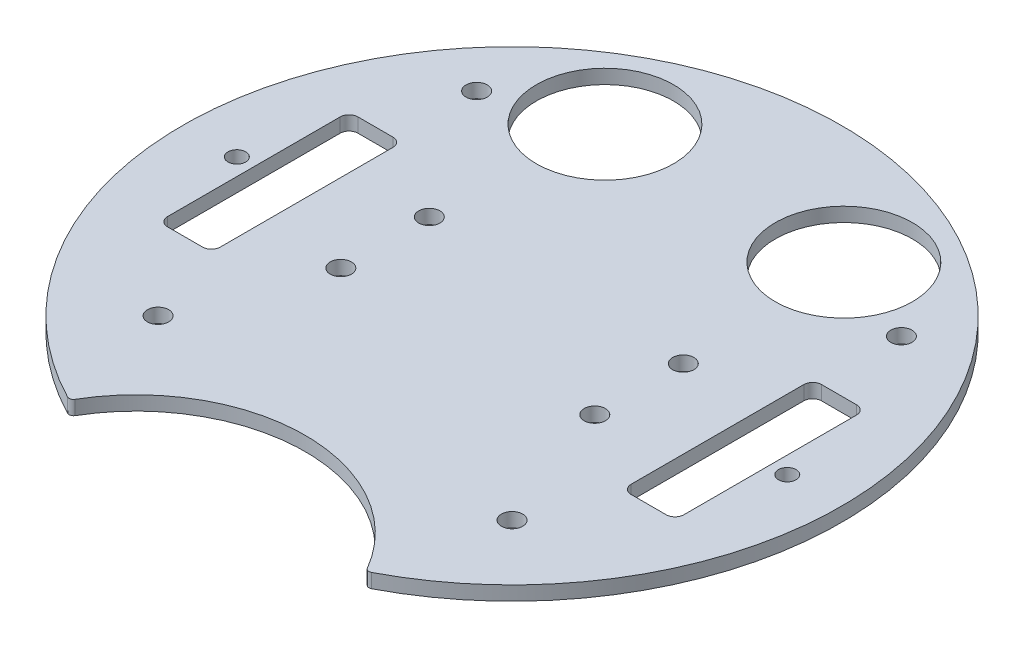
ISO-10303-21;
HEADER;
FILE_DESCRIPTION(('STEP AP214'),'2;1');
FILE_NAME('part.step','',(''),(''),'','','');
FILE_SCHEMA(('AUTOMOTIVE_DESIGN { 1 0 10303 214 1 1 1 1 }'));
ENDSEC;
DATA;
#1=APPLICATION_CONTEXT('core data for automotive mechanical design processes');
#2=APPLICATION_PROTOCOL_DEFINITION('international standard','automotive_design',2000,#1);
#3=PRODUCT_CONTEXT('',#1,'mechanical');
#4=PRODUCT('Part','Part','',(#3));
#5=PRODUCT_RELATED_PRODUCT_CATEGORY('part','',(#4));
#6=PRODUCT_DEFINITION_FORMATION('','',#4);
#7=PRODUCT_DEFINITION_CONTEXT('part definition',#1,'design');
#8=PRODUCT_DEFINITION('design','',#6,#7);
#9=PRODUCT_DEFINITION_SHAPE('','',#8);
#10=(LENGTH_UNIT() NAMED_UNIT(*) SI_UNIT(.MILLI.,.METRE.));
#11=(NAMED_UNIT(*) PLANE_ANGLE_UNIT() SI_UNIT($,.RADIAN.));
#12=(NAMED_UNIT(*) SI_UNIT($,.STERADIAN.) SOLID_ANGLE_UNIT());
#13=UNCERTAINTY_MEASURE_WITH_UNIT(LENGTH_MEASURE(1.E-05),#10,'distance_accuracy_value','');
#14=(GEOMETRIC_REPRESENTATION_CONTEXT(3) GLOBAL_UNCERTAINTY_ASSIGNED_CONTEXT((#13)) GLOBAL_UNIT_ASSIGNED_CONTEXT((#10,
#11,#12)) REPRESENTATION_CONTEXT('',''));
#15=CARTESIAN_POINT('',(0.,0.,0.));
#16=DIRECTION('',(0.,0.,1.));
#17=DIRECTION('',(1.,0.,0.));
#18=AXIS2_PLACEMENT_3D('',#15,#16,#17);
#19=CARTESIAN_POINT('',(33.8990896558132,3.2,65.2158088235294));
#20=DIRECTION('',(0.,-1.,0.));
#21=DIRECTION('',(0.,0.,-1.));
#22=AXIS2_PLACEMENT_3D('',#19,#20,#21);
#23=CYLINDRICAL_SURFACE('',#22,1.);
#24=CARTESIAN_POINT('',(33.8990896558132,0.,65.2158088235294));
#25=DIRECTION('',(0.,1.,0.));
#26=DIRECTION('',(0.,0.,-1.));
#27=AXIS2_PLACEMENT_3D('',#24,#25,#26);
#28=CIRCLE('',#27,1.);
#29=CARTESIAN_POINT('',(33.0354185817797,0.,65.7198646496815));
#30=VERTEX_POINT('',#29);
#31=CARTESIAN_POINT('',(34.3603017599739,0.,66.1030987394958));
#32=VERTEX_POINT('',#31);
#33=EDGE_CURVE('E338',#30,#32,#28,.T.);
#34=ORIENTED_EDGE('',*,*,#33,.T.);
#35=DIRECTION('',(0.,-1.,0.));
#36=VECTOR('',#35,1.);
#37=CARTESIAN_POINT('',(34.3603017599739,3.2,66.1030987394958));
#38=LINE('',#37,#36);
#39=CARTESIAN_POINT('',(34.3603017599739,3.2,66.1030987394958));
#40=VERTEX_POINT('',#39);
#41=EDGE_CURVE('E11',#40,#32,#38,.T.);
#42=ORIENTED_EDGE('',*,*,#41,.F.);
#43=CARTESIAN_POINT('',(33.8990896558132,3.2,65.2158088235294));
#44=DIRECTION('',(0.,1.,0.));
#45=DIRECTION('',(0.,0.,-1.));
#46=AXIS2_PLACEMENT_3D('',#43,#44,#45);
#47=CIRCLE('',#46,1.);
#48=CARTESIAN_POINT('',(33.0354185817797,3.2,65.7198646496815));
#49=VERTEX_POINT('',#48);
#50=EDGE_CURVE('E341',#49,#40,#47,.T.);
#51=ORIENTED_EDGE('',*,*,#50,.F.);
#52=DIRECTION('',(0.,-1.,0.));
#53=VECTOR('',#52,1.);
#54=CARTESIAN_POINT('',(33.0354185817797,3.2,65.7198646496815));
#55=LINE('',#54,#53);
#56=EDGE_CURVE('E351',#49,#30,#55,.T.);
#57=ORIENTED_EDGE('',*,*,#56,.T.);
#58=EDGE_LOOP('',(#34,#42,#51,#57));
#59=FACE_BOUND('',#58,.T.);
#60=ADVANCED_FACE('F33',(#59),#23,.T.);
#61=CARTESIAN_POINT('',(0.,3.2,0.));
#62=DIRECTION('',(0.,-1.,0.));
#63=DIRECTION('',(0.,0.,-1.));
#64=AXIS2_PLACEMENT_3D('',#61,#62,#63);
#65=CYLINDRICAL_SURFACE('',#64,74.5);
#66=CARTESIAN_POINT('',(0.,0.,0.));
#67=DIRECTION('',(0.,1.,0.));
#68=DIRECTION('',(0.,0.,1.));
#69=AXIS2_PLACEMENT_3D('',#66,#67,#68);
#70=CIRCLE('',#69,74.5);
#71=CARTESIAN_POINT('',(-34.360301759974,0.,66.1030987394958));
#72=VERTEX_POINT('',#71);
#73=EDGE_CURVE('E354',#32,#72,#70,.T.);
#74=ORIENTED_EDGE('',*,*,#73,.T.);
#75=DIRECTION('',(0.,-1.,0.));
#76=VECTOR('',#75,1.);
#77=CARTESIAN_POINT('',(-34.360301759974,3.2,66.1030987394958));
#78=LINE('',#77,#76);
#79=CARTESIAN_POINT('',(-34.360301759974,3.2,66.1030987394958));
#80=VERTEX_POINT('',#79);
#81=EDGE_CURVE('E40',#80,#72,#78,.T.);
#82=ORIENTED_EDGE('',*,*,#81,.F.);
#83=CARTESIAN_POINT('',(0.,3.2,0.));
#84=DIRECTION('',(0.,1.,0.));
#85=DIRECTION('',(0.,0.,1.));
#86=AXIS2_PLACEMENT_3D('',#83,#84,#85);
#87=CIRCLE('',#86,74.5);
#88=EDGE_CURVE('E344',#40,#80,#87,.T.);
#89=ORIENTED_EDGE('',*,*,#88,.F.);
#90=ORIENTED_EDGE('',*,*,#41,.T.);
#91=EDGE_LOOP('',(#74,#82,#89,#90));
#92=FACE_BOUND('',#91,.T.);
#93=ADVANCED_FACE('F383',(#92),#65,.T.);
#94=CARTESIAN_POINT('',(-33.8990896558132,3.2,65.2158088235294));
#95=DIRECTION('',(0.,-1.,0.));
#96=DIRECTION('',(0.,0.,-1.));
#97=AXIS2_PLACEMENT_3D('',#94,#95,#96);
#98=CYLINDRICAL_SURFACE('',#97,1.);
#99=CARTESIAN_POINT('',(-33.8990896558132,0.,65.2158088235294));
#100=DIRECTION('',(0.,1.,0.));
#101=DIRECTION('',(0.,0.,-1.));
#102=AXIS2_PLACEMENT_3D('',#99,#100,#101);
#103=CIRCLE('',#102,1.);
#104=CARTESIAN_POINT('',(-33.0354185817797,0.,65.7198646496815));
#105=VERTEX_POINT('',#104);
#106=EDGE_CURVE('E356',#72,#105,#103,.T.);
#107=ORIENTED_EDGE('',*,*,#106,.T.);
#108=DIRECTION('',(0.,-1.,0.));
#109=VECTOR('',#108,1.);
#110=CARTESIAN_POINT('',(-33.0354185817797,3.2,65.7198646496815));
#111=LINE('',#110,#109);
#112=CARTESIAN_POINT('',(-33.0354185817797,3.2,65.7198646496815));
#113=VERTEX_POINT('',#112);
#114=EDGE_CURVE('E361',#113,#105,#111,.T.);
#115=ORIENTED_EDGE('',*,*,#114,.F.);
#116=CARTESIAN_POINT('',(-33.8990896558132,3.2,65.2158088235294));
#117=DIRECTION('',(0.,1.,0.));
#118=DIRECTION('',(0.,0.,-1.));
#119=AXIS2_PLACEMENT_3D('',#116,#117,#118);
#120=CIRCLE('',#119,1.);
#121=EDGE_CURVE('E347',#80,#113,#120,.T.);
#122=ORIENTED_EDGE('',*,*,#121,.F.);
#123=ORIENTED_EDGE('',*,*,#81,.T.);
#124=EDGE_LOOP('',(#107,#115,#122,#123));
#125=FACE_BOUND('',#124,.T.);
#126=ADVANCED_FACE('F368',(#125),#98,.T.);
#127=CARTESIAN_POINT('',(0.,3.2,85.));
#128=DIRECTION('',(0.,-1.,0.));
#129=DIRECTION('',(0.,0.,-1.));
#130=AXIS2_PLACEMENT_3D('',#127,#128,#129);
#131=CYLINDRICAL_SURFACE('',#130,38.25);
#132=CARTESIAN_POINT('',(0.,0.,85.));
#133=DIRECTION('',(0.,-1.,0.));
#134=DIRECTION('',(0.,0.,1.));
#135=AXIS2_PLACEMENT_3D('',#132,#133,#134);
#136=CIRCLE('',#135,38.25);
#137=EDGE_CURVE('E345',#105,#30,#136,.T.);
#138=ORIENTED_EDGE('',*,*,#137,.T.);
#139=ORIENTED_EDGE('',*,*,#56,.F.);
#140=CARTESIAN_POINT('',(0.,3.2,85.));
#141=DIRECTION('',(0.,-1.,0.));
#142=DIRECTION('',(0.,0.,1.));
#143=AXIS2_PLACEMENT_3D('',#140,#141,#142);
#144=CIRCLE('',#143,38.25);
#145=EDGE_CURVE('E349',#113,#49,#144,.T.);
#146=ORIENTED_EDGE('',*,*,#145,.F.);
#147=ORIENTED_EDGE('',*,*,#114,.T.);
#148=EDGE_LOOP('',(#138,#139,#146,#147));
#149=FACE_BOUND('',#148,.T.);
#150=ADVANCED_FACE('F376',(#149),#131,.F.);
#151=CARTESIAN_POINT('',(16.9495448279066,3.2,75.1079044117647));
#152=DIRECTION('',(0.,-1.,0.));
#153=DIRECTION('',(0.,0.,-1.));
#154=AXIS2_PLACEMENT_3D('',#151,#152,#153);
#155=PLANE('',#154);
#156=CARTESIAN_POINT('',(27.,3.2,-48.));
#157=DIRECTION('',(0.,1.,0.));
#158=DIRECTION('',(0.,0.,1.));
#159=AXIS2_PLACEMENT_3D('',#156,#157,#158);
#160=CIRCLE('',#159,15.5);
#161=CARTESIAN_POINT('',(27.,3.2,-32.5));
#162=VERTEX_POINT('',#161);
#163=EDGE_CURVE('E513',#162,#162,#160,.T.);
#164=ORIENTED_EDGE('',*,*,#163,.F.);
#165=EDGE_LOOP('',(#164));
#166=FACE_BOUND('',#165,.T.);
#167=CARTESIAN_POINT('',(-27.,3.2,-48.));
#168=DIRECTION('',(0.,1.,0.));
#169=DIRECTION('',(0.,0.,1.));
#170=AXIS2_PLACEMENT_3D('',#167,#168,#169);
#171=CIRCLE('',#170,15.5);
#172=CARTESIAN_POINT('',(-27.,3.2,-32.5));
#173=VERTEX_POINT('',#172);
#174=EDGE_CURVE('E515',#173,#173,#171,.T.);
#175=ORIENTED_EDGE('',*,*,#174,.F.);
#176=EDGE_LOOP('',(#175));
#177=FACE_BOUND('',#176,.T.);
#178=CARTESIAN_POINT('',(-48.,3.2,-40.));
#179=DIRECTION('',(0.,1.,0.));
#180=DIRECTION('',(0.,0.,-1.));
#181=AXIS2_PLACEMENT_3D('',#178,#179,#180);
#182=CIRCLE('',#181,2.4);
#183=CARTESIAN_POINT('',(-48.,3.2,-42.4));
#184=VERTEX_POINT('',#183);
#185=EDGE_CURVE('E521',#184,#184,#182,.T.);
#186=ORIENTED_EDGE('',*,*,#185,.F.);
#187=EDGE_LOOP('',(#186));
#188=FACE_BOUND('',#187,.T.);
#189=CARTESIAN_POINT('',(40.,3.2,40.));
#190=DIRECTION('',(0.,1.,0.));
#191=DIRECTION('',(0.,0.,-1.));
#192=AXIS2_PLACEMENT_3D('',#189,#190,#191);
#193=CIRCLE('',#192,2.4);
#194=CARTESIAN_POINT('',(40.,3.2,37.6));
#195=VERTEX_POINT('',#194);
#196=EDGE_CURVE('E528',#195,#195,#193,.T.);
#197=ORIENTED_EDGE('',*,*,#196,.F.);
#198=EDGE_LOOP('',(#197));
#199=FACE_BOUND('',#198,.T.);
#200=CARTESIAN_POINT('',(-40.,3.2,40.));
#201=DIRECTION('',(0.,1.,0.));
#202=DIRECTION('',(0.,0.,1.));
#203=AXIS2_PLACEMENT_3D('',#200,#201,#202);
#204=CIRCLE('',#203,2.4);
#205=CARTESIAN_POINT('',(-40.,3.2,42.4));
#206=VERTEX_POINT('',#205);
#207=EDGE_CURVE('E527',#206,#206,#204,.T.);
#208=ORIENTED_EDGE('',*,*,#207,.F.);
#209=EDGE_LOOP('',(#208));
#210=FACE_BOUND('',#209,.T.);
#211=CARTESIAN_POINT('',(48.,3.2,-40.));
#212=DIRECTION('',(0.,1.,0.));
#213=DIRECTION('',(0.,0.,1.));
#214=AXIS2_PLACEMENT_3D('',#211,#212,#213);
#215=CIRCLE('',#214,2.4);
#216=CARTESIAN_POINT('',(48.,3.2,-37.6));
#217=VERTEX_POINT('',#216);
#218=EDGE_CURVE('E539',#217,#217,#215,.T.);
#219=ORIENTED_EDGE('',*,*,#218,.F.);
#220=EDGE_LOOP('',(#219));
#221=FACE_BOUND('',#220,.T.);
#222=CARTESIAN_POINT('',(-28.7007386859688,3.2,10.0000000000002));
#223=DIRECTION('',(0.,-1.,0.));
#224=DIRECTION('',(0.,0.,-1.));
#225=AXIS2_PLACEMENT_3D('',#222,#223,#224);
#226=CIRCLE('',#225,2.4);
#227=CARTESIAN_POINT('',(-28.7007386859688,3.2,7.60000000000018));
#228=VERTEX_POINT('',#227);
#229=EDGE_CURVE('E305',#228,#228,#226,.T.);
#230=ORIENTED_EDGE('',*,*,#229,.T.);
#231=EDGE_LOOP('',(#230));
#232=FACE_BOUND('',#231,.T.);
#233=CARTESIAN_POINT('',(-28.7007386859688,3.2,-9.99999999999983));
#234=DIRECTION('',(0.,-1.,0.));
#235=DIRECTION('',(0.,0.,-1.));
#236=AXIS2_PLACEMENT_3D('',#233,#234,#235);
#237=CIRCLE('',#236,2.4);
#238=CARTESIAN_POINT('',(-28.7007386859688,3.2,-12.3999999999998));
#239=VERTEX_POINT('',#238);
#240=EDGE_CURVE('E312',#239,#239,#237,.T.);
#241=ORIENTED_EDGE('',*,*,#240,.T.);
#242=EDGE_LOOP('',(#241));
#243=FACE_BOUND('',#242,.T.);
#244=CARTESIAN_POINT('',(28.7007386859688,3.2,-9.99999999999982));
#245=DIRECTION('',(0.,-1.,0.));
#246=DIRECTION('',(0.,0.,1.));
#247=AXIS2_PLACEMENT_3D('',#244,#245,#246);
#248=CIRCLE('',#247,2.4);
#249=CARTESIAN_POINT('',(28.7007386859688,3.2,-7.59999999999982));
#250=VERTEX_POINT('',#249);
#251=EDGE_CURVE('E318',#250,#250,#248,.T.);
#252=ORIENTED_EDGE('',*,*,#251,.T.);
#253=EDGE_LOOP('',(#252));
#254=FACE_BOUND('',#253,.T.);
#255=CARTESIAN_POINT('',(28.7007386859688,3.2,10.0000000000002));
#256=DIRECTION('',(0.,-1.,0.));
#257=DIRECTION('',(0.,0.,1.));
#258=AXIS2_PLACEMENT_3D('',#255,#256,#257);
#259=CIRCLE('',#258,2.4);
#260=CARTESIAN_POINT('',(28.7007386859688,3.2,12.4000000000002));
#261=VERTEX_POINT('',#260);
#262=EDGE_CURVE('E324',#261,#261,#259,.T.);
#263=ORIENTED_EDGE('',*,*,#262,.T.);
#264=EDGE_LOOP('',(#263));
#265=FACE_BOUND('',#264,.T.);
#266=CARTESIAN_POINT('',(62.2,3.2,1.78151924979983E-13));
#267=DIRECTION('',(0.,-1.,0.));
#268=DIRECTION('',(0.,0.,1.));
#269=AXIS2_PLACEMENT_3D('',#266,#267,#268);
#270=CIRCLE('',#269,2.);
#271=CARTESIAN_POINT('',(62.2,3.2,2.00000000000017));
#272=VERTEX_POINT('',#271);
#273=EDGE_CURVE('E330',#272,#272,#270,.T.);
#274=ORIENTED_EDGE('',*,*,#273,.T.);
#275=EDGE_LOOP('',(#274));
#276=FACE_BOUND('',#275,.T.);
#277=CARTESIAN_POINT('',(-62.2,3.2,1.6291731879859E-13));
#278=DIRECTION('',(0.,-1.,0.));
#279=DIRECTION('',(0.,0.,-1.));
#280=AXIS2_PLACEMENT_3D('',#277,#278,#279);
#281=CIRCLE('',#280,2.);
#282=CARTESIAN_POINT('',(-62.2,3.2,-1.99999999999984));
#283=VERTEX_POINT('',#282);
#284=EDGE_CURVE('E335',#283,#283,#281,.T.);
#285=ORIENTED_EDGE('',*,*,#284,.T.);
#286=EDGE_LOOP('',(#285));
#287=FACE_BOUND('',#286,.T.);
#288=DIRECTION('',(1.,0.,0.));
#289=VECTOR('',#288,1.);
#290=CARTESIAN_POINT('',(-56.3557864376269,3.2,21.5201365909515));
#291=LINE('',#290,#289);
#292=CARTESIAN_POINT('',(-56.3557864376269,3.2,21.5201365909515));
#293=VERTEX_POINT('',#292);
#294=CARTESIAN_POINT('',(-48.4242135623731,3.2,21.5201365909515));
#295=VERTEX_POINT('',#294);
#296=EDGE_CURVE('E265',#293,#295,#291,.T.);
#297=ORIENTED_EDGE('',*,*,#296,.F.);
#298=CARTESIAN_POINT('',(-56.3557864376269,3.2,19.5201365909515));
#299=DIRECTION('',(0.,1.,0.));
#300=DIRECTION('',(0.,0.,1.));
#301=AXIS2_PLACEMENT_3D('',#298,#299,#300);
#302=CIRCLE('',#301,2.);
#303=CARTESIAN_POINT('',(-58.3557864376269,3.2,19.5201365909515));
#304=VERTEX_POINT('',#303);
#305=EDGE_CURVE('E225',#304,#293,#302,.T.);
#306=ORIENTED_EDGE('',*,*,#305,.F.);
#307=DIRECTION('',(0.,0.,1.));
#308=VECTOR('',#307,1.);
#309=CARTESIAN_POINT('',(-58.3557864376269,3.2,-19.5201365909512));
#310=LINE('',#309,#308);
#311=CARTESIAN_POINT('',(-58.3557864376269,3.2,-19.5201365909512));
#312=VERTEX_POINT('',#311);
#313=EDGE_CURVE('E245',#312,#304,#310,.T.);
#314=ORIENTED_EDGE('',*,*,#313,.F.);
#315=CARTESIAN_POINT('',(-56.3557864376269,3.2,-19.5201365909512));
#316=DIRECTION('',(0.,1.,0.));
#317=DIRECTION('',(0.,0.,1.));
#318=AXIS2_PLACEMENT_3D('',#315,#316,#317);
#319=CIRCLE('',#318,1.99999999999999);
#320=CARTESIAN_POINT('',(-56.3557864376269,3.2,-21.5201365909512));
#321=VERTEX_POINT('',#320);
#322=EDGE_CURVE('E278',#321,#312,#319,.T.);
#323=ORIENTED_EDGE('',*,*,#322,.F.);
#324=DIRECTION('',(-1.,0.,0.));
#325=VECTOR('',#324,1.);
#326=CARTESIAN_POINT('',(-56.3557864376269,3.2,-21.5201365909512));
#327=LINE('',#326,#325);
#328=CARTESIAN_POINT('',(-48.4242135623731,3.2,-21.5201365909512));
#329=VERTEX_POINT('',#328);
#330=EDGE_CURVE('E275',#329,#321,#327,.T.);
#331=ORIENTED_EDGE('',*,*,#330,.F.);
#332=CARTESIAN_POINT('',(-48.4242135623731,3.2,-19.5201365909512));
#333=DIRECTION('',(0.,1.,0.));
#334=DIRECTION('',(0.,0.,-1.));
#335=AXIS2_PLACEMENT_3D('',#332,#333,#334);
#336=CIRCLE('',#335,2.);
#337=CARTESIAN_POINT('',(-46.4242135623731,3.2,-19.5201365909512));
#338=VERTEX_POINT('',#337);
#339=EDGE_CURVE('E273',#338,#329,#336,.T.);
#340=ORIENTED_EDGE('',*,*,#339,.F.);
#341=DIRECTION('',(0.,0.,-1.));
#342=VECTOR('',#341,1.);
#343=CARTESIAN_POINT('',(-46.4242135623731,3.2,-19.5201365909512));
#344=LINE('',#343,#342);
#345=CARTESIAN_POINT('',(-46.4242135623731,3.2,19.5201365909515));
#346=VERTEX_POINT('',#345);
#347=EDGE_CURVE('E270',#346,#338,#344,.T.);
#348=ORIENTED_EDGE('',*,*,#347,.F.);
#349=CARTESIAN_POINT('',(-48.4242135623731,3.2,19.5201365909515));
#350=DIRECTION('',(0.,1.,0.));
#351=DIRECTION('',(0.,0.,1.));
#352=AXIS2_PLACEMENT_3D('',#349,#350,#351);
#353=CIRCLE('',#352,2.);
#354=EDGE_CURVE('E268',#295,#346,#353,.T.);
#355=ORIENTED_EDGE('',*,*,#354,.F.);
#356=EDGE_LOOP('',(#297,#306,#314,#323,#331,#340,#348,#355));
#357=FACE_BOUND('',#356,.T.);
#358=DIRECTION('',(-1.,0.,0.));
#359=VECTOR('',#358,1.);
#360=CARTESIAN_POINT('',(56.3557864376269,3.2,-21.5201365909512));
#361=LINE('',#360,#359);
#362=CARTESIAN_POINT('',(56.3557864376269,3.2,-21.5201365909512));
#363=VERTEX_POINT('',#362);
#364=CARTESIAN_POINT('',(48.4242135623731,3.2,-21.5201365909512));
#365=VERTEX_POINT('',#364);
#366=EDGE_CURVE('E206',#363,#365,#361,.T.);
#367=ORIENTED_EDGE('',*,*,#366,.F.);
#368=CARTESIAN_POINT('',(56.3557864376269,3.2,-19.5201365909512));
#369=DIRECTION('',(0.,1.,0.));
#370=DIRECTION('',(0.,0.,-1.));
#371=AXIS2_PLACEMENT_3D('',#368,#369,#370);
#372=CIRCLE('',#371,1.99999999999999);
#373=CARTESIAN_POINT('',(58.3557864376269,3.2,-19.5201365909512));
#374=VERTEX_POINT('',#373);
#375=EDGE_CURVE('E184',#374,#363,#372,.T.);
#376=ORIENTED_EDGE('',*,*,#375,.F.);
#377=DIRECTION('',(0.,0.,-1.));
#378=VECTOR('',#377,1.);
#379=CARTESIAN_POINT('',(58.3557864376269,3.2,-19.5201365909512));
#380=LINE('',#379,#378);
#381=CARTESIAN_POINT('',(58.3557864376269,3.2,19.5201365909515));
#382=VERTEX_POINT('',#381);
#383=EDGE_CURVE('E181',#382,#374,#380,.T.);
#384=ORIENTED_EDGE('',*,*,#383,.F.);
#385=CARTESIAN_POINT('',(56.3557864376269,3.2,19.5201365909515));
#386=DIRECTION('',(0.,1.,0.));
#387=DIRECTION('',(0.,0.,-1.));
#388=AXIS2_PLACEMENT_3D('',#385,#386,#387);
#389=CIRCLE('',#388,2.);
#390=CARTESIAN_POINT('',(56.3557864376269,3.2,21.5201365909515));
#391=VERTEX_POINT('',#390);
#392=EDGE_CURVE('E219',#391,#382,#389,.T.);
#393=ORIENTED_EDGE('',*,*,#392,.F.);
#394=DIRECTION('',(1.,0.,0.));
#395=VECTOR('',#394,1.);
#396=CARTESIAN_POINT('',(56.3557864376269,3.2,21.5201365909515));
#397=LINE('',#396,#395);
#398=CARTESIAN_POINT('',(48.4242135623731,3.2,21.5201365909515));
#399=VERTEX_POINT('',#398);
#400=EDGE_CURVE('E216',#399,#391,#397,.T.);
#401=ORIENTED_EDGE('',*,*,#400,.F.);
#402=CARTESIAN_POINT('',(48.4242135623731,3.2,19.5201365909515));
#403=DIRECTION('',(0.,1.,0.));
#404=DIRECTION('',(0.,0.,-1.));
#405=AXIS2_PLACEMENT_3D('',#402,#403,#404);
#406=CIRCLE('',#405,2.);
#407=CARTESIAN_POINT('',(46.4242135623731,3.2,19.5201365909515));
#408=VERTEX_POINT('',#407);
#409=EDGE_CURVE('E214',#408,#399,#406,.T.);
#410=ORIENTED_EDGE('',*,*,#409,.F.);
#411=DIRECTION('',(0.,0.,1.));
#412=VECTOR('',#411,1.);
#413=CARTESIAN_POINT('',(46.4242135623731,3.2,-19.5201365909512));
#414=LINE('',#413,#412);
#415=CARTESIAN_POINT('',(46.4242135623731,3.2,-19.5201365909512));
#416=VERTEX_POINT('',#415);
#417=EDGE_CURVE('E211',#416,#408,#414,.T.);
#418=ORIENTED_EDGE('',*,*,#417,.F.);
#419=CARTESIAN_POINT('',(48.4242135623731,3.2,-19.5201365909512));
#420=DIRECTION('',(0.,1.,0.));
#421=DIRECTION('',(0.,0.,1.));
#422=AXIS2_PLACEMENT_3D('',#419,#420,#421);
#423=CIRCLE('',#422,2.);
#424=EDGE_CURVE('E209',#365,#416,#423,.T.);
#425=ORIENTED_EDGE('',*,*,#424,.F.);
#426=EDGE_LOOP('',(#367,#376,#384,#393,#401,#410,#418,#425));
#427=FACE_BOUND('',#426,.T.);
#428=ORIENTED_EDGE('',*,*,#50,.T.);
#429=ORIENTED_EDGE('',*,*,#88,.T.);
#430=ORIENTED_EDGE('',*,*,#121,.T.);
#431=ORIENTED_EDGE('',*,*,#145,.T.);
#432=EDGE_LOOP('',(#428,#429,#430,#431));
#433=FACE_BOUND('',#432,.T.);
#434=ADVANCED_FACE('F382',(#166,#177,#188,#199,#210,#221,#232,#243,#254,#265,#276,#287,#357,
#427,#433),#155,.F.);
#435=CARTESIAN_POINT('',(16.9495448279066,0.,75.1079044117647));
#436=DIRECTION('',(0.,-1.,0.));
#437=DIRECTION('',(0.,0.,-1.));
#438=AXIS2_PLACEMENT_3D('',#435,#436,#437);
#439=PLANE('',#438);
#440=CARTESIAN_POINT('',(27.,0.,-48.));
#441=DIRECTION('',(0.,1.,0.));
#442=DIRECTION('',(0.,0.,1.));
#443=AXIS2_PLACEMENT_3D('',#440,#441,#442);
#444=CIRCLE('',#443,15.5);
#445=CARTESIAN_POINT('',(27.,0.,-32.5));
#446=VERTEX_POINT('',#445);
#447=EDGE_CURVE('E510',#446,#446,#444,.T.);
#448=ORIENTED_EDGE('',*,*,#447,.T.);
#449=EDGE_LOOP('',(#448));
#450=FACE_BOUND('',#449,.T.);
#451=CARTESIAN_POINT('',(-27.,0.,-48.));
#452=DIRECTION('',(0.,1.,0.));
#453=DIRECTION('',(0.,0.,1.));
#454=AXIS2_PLACEMENT_3D('',#451,#452,#453);
#455=CIRCLE('',#454,15.5);
#456=CARTESIAN_POINT('',(-27.,0.,-32.5));
#457=VERTEX_POINT('',#456);
#458=EDGE_CURVE('E518',#457,#457,#455,.T.);
#459=ORIENTED_EDGE('',*,*,#458,.T.);
#460=EDGE_LOOP('',(#459));
#461=FACE_BOUND('',#460,.T.);
#462=CARTESIAN_POINT('',(-48.,0.,-40.));
#463=DIRECTION('',(0.,1.,0.));
#464=DIRECTION('',(0.,0.,-1.));
#465=AXIS2_PLACEMENT_3D('',#462,#463,#464);
#466=CIRCLE('',#465,2.4);
#467=CARTESIAN_POINT('',(-48.,0.,-42.4));
#468=VERTEX_POINT('',#467);
#469=EDGE_CURVE('E531',#468,#468,#466,.T.);
#470=ORIENTED_EDGE('',*,*,#469,.T.);
#471=EDGE_LOOP('',(#470));
#472=FACE_BOUND('',#471,.T.);
#473=CARTESIAN_POINT('',(40.,0.,40.));
#474=DIRECTION('',(0.,1.,0.));
#475=DIRECTION('',(0.,0.,-1.));
#476=AXIS2_PLACEMENT_3D('',#473,#474,#475);
#477=CIRCLE('',#476,2.4);
#478=CARTESIAN_POINT('',(40.,0.,37.6));
#479=VERTEX_POINT('',#478);
#480=EDGE_CURVE('E524',#479,#479,#477,.T.);
#481=ORIENTED_EDGE('',*,*,#480,.T.);
#482=EDGE_LOOP('',(#481));
#483=FACE_BOUND('',#482,.T.);
#484=CARTESIAN_POINT('',(-40.,0.,40.));
#485=DIRECTION('',(0.,1.,0.));
#486=DIRECTION('',(0.,0.,1.));
#487=AXIS2_PLACEMENT_3D('',#484,#485,#486);
#488=CIRCLE('',#487,2.4);
#489=CARTESIAN_POINT('',(-40.,0.,42.4));
#490=VERTEX_POINT('',#489);
#491=EDGE_CURVE('E536',#490,#490,#488,.T.);
#492=ORIENTED_EDGE('',*,*,#491,.T.);
#493=EDGE_LOOP('',(#492));
#494=FACE_BOUND('',#493,.T.);
#495=CARTESIAN_POINT('',(48.,0.,-40.));
#496=DIRECTION('',(0.,1.,0.));
#497=DIRECTION('',(0.,0.,1.));
#498=AXIS2_PLACEMENT_3D('',#495,#496,#497);
#499=CIRCLE('',#498,2.4);
#500=CARTESIAN_POINT('',(48.,0.,-37.6));
#501=VERTEX_POINT('',#500);
#502=EDGE_CURVE('E207',#501,#501,#499,.T.);
#503=ORIENTED_EDGE('',*,*,#502,.T.);
#504=EDGE_LOOP('',(#503));
#505=FACE_BOUND('',#504,.T.);
#506=CARTESIAN_POINT('',(56.3557864376269,0.,-19.5201365909512));
#507=DIRECTION('',(0.,1.,0.));
#508=DIRECTION('',(0.,0.,-1.));
#509=AXIS2_PLACEMENT_3D('',#506,#507,#508);
#510=CIRCLE('',#509,1.99999999999999);
#511=CARTESIAN_POINT('',(58.3557864376269,0.,-19.5201365909512));
#512=VERTEX_POINT('',#511);
#513=CARTESIAN_POINT('',(56.3557864376269,0.,-21.5201365909512));
#514=VERTEX_POINT('',#513);
#515=EDGE_CURVE('E173',#512,#514,#510,.T.);
#516=ORIENTED_EDGE('',*,*,#515,.T.);
#517=DIRECTION('',(-1.,0.,0.));
#518=VECTOR('',#517,1.);
#519=CARTESIAN_POINT('',(56.3557864376269,0.,-21.5201365909512));
#520=LINE('',#519,#518);
#521=CARTESIAN_POINT('',(48.4242135623731,0.,-21.5201365909512));
#522=VERTEX_POINT('',#521);
#523=EDGE_CURVE('E176',#514,#522,#520,.T.);
#524=ORIENTED_EDGE('',*,*,#523,.T.);
#525=CARTESIAN_POINT('',(48.4242135623731,0.,-19.5201365909512));
#526=DIRECTION('',(0.,1.,0.));
#527=DIRECTION('',(0.,0.,1.));
#528=AXIS2_PLACEMENT_3D('',#525,#526,#527);
#529=CIRCLE('',#528,2.);
#530=CARTESIAN_POINT('',(46.4242135623731,0.,-19.5201365909512));
#531=VERTEX_POINT('',#530);
#532=EDGE_CURVE('E55',#522,#531,#529,.T.);
#533=ORIENTED_EDGE('',*,*,#532,.T.);
#534=DIRECTION('',(0.,0.,1.));
#535=VECTOR('',#534,1.);
#536=CARTESIAN_POINT('',(46.4242135623731,0.,-19.5201365909512));
#537=LINE('',#536,#535);
#538=CARTESIAN_POINT('',(46.4242135623731,0.,19.5201365909515));
#539=VERTEX_POINT('',#538);
#540=EDGE_CURVE('E190',#531,#539,#537,.T.);
#541=ORIENTED_EDGE('',*,*,#540,.T.);
#542=CARTESIAN_POINT('',(48.4242135623731,0.,19.5201365909515));
#543=DIRECTION('',(0.,1.,0.));
#544=DIRECTION('',(0.,0.,-1.));
#545=AXIS2_PLACEMENT_3D('',#542,#543,#544);
#546=CIRCLE('',#545,2.);
#547=CARTESIAN_POINT('',(48.4242135623731,0.,21.5201365909515));
#548=VERTEX_POINT('',#547);
#549=EDGE_CURVE('E196',#539,#548,#546,.T.);
#550=ORIENTED_EDGE('',*,*,#549,.T.);
#551=DIRECTION('',(1.,0.,0.));
#552=VECTOR('',#551,1.);
#553=CARTESIAN_POINT('',(56.3557864376269,0.,21.5201365909515));
#554=LINE('',#553,#552);
#555=CARTESIAN_POINT('',(56.3557864376269,0.,21.5201365909515));
#556=VERTEX_POINT('',#555);
#557=EDGE_CURVE('E199',#548,#556,#554,.T.);
#558=ORIENTED_EDGE('',*,*,#557,.T.);
#559=CARTESIAN_POINT('',(56.3557864376269,0.,19.5201365909515));
#560=DIRECTION('',(0.,1.,0.));
#561=DIRECTION('',(0.,0.,-1.));
#562=AXIS2_PLACEMENT_3D('',#559,#560,#561);
#563=CIRCLE('',#562,2.);
#564=CARTESIAN_POINT('',(58.3557864376269,0.,19.5201365909515));
#565=VERTEX_POINT('',#564);
#566=EDGE_CURVE('E202',#556,#565,#563,.T.);
#567=ORIENTED_EDGE('',*,*,#566,.T.);
#568=DIRECTION('',(0.,0.,-1.));
#569=VECTOR('',#568,1.);
#570=CARTESIAN_POINT('',(58.3557864376269,0.,-19.5201365909512));
#571=LINE('',#570,#569);
#572=EDGE_CURVE('E178',#565,#512,#571,.T.);
#573=ORIENTED_EDGE('',*,*,#572,.T.);
#574=EDGE_LOOP('',(#516,#524,#533,#541,#550,#558,#567,#573));
#575=FACE_BOUND('',#574,.T.);
#576=CARTESIAN_POINT('',(-56.3557864376269,0.,19.5201365909515));
#577=DIRECTION('',(0.,1.,0.));
#578=DIRECTION('',(0.,0.,1.));
#579=AXIS2_PLACEMENT_3D('',#576,#577,#578);
#580=CIRCLE('',#579,2.);
#581=CARTESIAN_POINT('',(-58.3557864376269,0.,19.5201365909515));
#582=VERTEX_POINT('',#581);
#583=CARTESIAN_POINT('',(-56.3557864376269,0.,21.5201365909515));
#584=VERTEX_POINT('',#583);
#585=EDGE_CURVE('E241',#582,#584,#580,.T.);
#586=ORIENTED_EDGE('',*,*,#585,.T.);
#587=DIRECTION('',(1.,0.,0.));
#588=VECTOR('',#587,1.);
#589=CARTESIAN_POINT('',(-56.3557864376269,0.,21.5201365909515));
#590=LINE('',#589,#588);
#591=CARTESIAN_POINT('',(-48.4242135623731,0.,21.5201365909515));
#592=VERTEX_POINT('',#591);
#593=EDGE_CURVE('E244',#584,#592,#590,.T.);
#594=ORIENTED_EDGE('',*,*,#593,.T.);
#595=CARTESIAN_POINT('',(-48.4242135623731,0.,19.5201365909515));
#596=DIRECTION('',(0.,1.,0.));
#597=DIRECTION('',(0.,0.,1.));
#598=AXIS2_PLACEMENT_3D('',#595,#596,#597);
#599=CIRCLE('',#598,2.);
#600=CARTESIAN_POINT('',(-46.4242135623731,0.,19.5201365909515));
#601=VERTEX_POINT('',#600);
#602=EDGE_CURVE('E248',#592,#601,#599,.T.);
#603=ORIENTED_EDGE('',*,*,#602,.T.);
#604=DIRECTION('',(0.,0.,-1.));
#605=VECTOR('',#604,1.);
#606=CARTESIAN_POINT('',(-46.4242135623731,0.,-19.5201365909512));
#607=LINE('',#606,#605);
#608=CARTESIAN_POINT('',(-46.4242135623731,0.,-19.5201365909512));
#609=VERTEX_POINT('',#608);
#610=EDGE_CURVE('E250',#601,#609,#607,.T.);
#611=ORIENTED_EDGE('',*,*,#610,.T.);
#612=CARTESIAN_POINT('',(-48.4242135623731,0.,-19.5201365909512));
#613=DIRECTION('',(0.,1.,0.));
#614=DIRECTION('',(0.,0.,-1.));
#615=AXIS2_PLACEMENT_3D('',#612,#613,#614);
#616=CIRCLE('',#615,2.);
#617=CARTESIAN_POINT('',(-48.4242135623731,0.,-21.5201365909512));
#618=VERTEX_POINT('',#617);
#619=EDGE_CURVE('E253',#609,#618,#616,.T.);
#620=ORIENTED_EDGE('',*,*,#619,.T.);
#621=DIRECTION('',(-1.,0.,0.));
#622=VECTOR('',#621,1.);
#623=CARTESIAN_POINT('',(-56.3557864376269,0.,-21.5201365909512));
#624=LINE('',#623,#622);
#625=CARTESIAN_POINT('',(-56.3557864376269,0.,-21.5201365909512));
#626=VERTEX_POINT('',#625);
#627=EDGE_CURVE('E255',#618,#626,#624,.T.);
#628=ORIENTED_EDGE('',*,*,#627,.T.);
#629=CARTESIAN_POINT('',(-56.3557864376269,0.,-19.5201365909512));
#630=DIRECTION('',(0.,1.,0.));
#631=DIRECTION('',(0.,0.,1.));
#632=AXIS2_PLACEMENT_3D('',#629,#630,#631);
#633=CIRCLE('',#632,1.99999999999999);
#634=CARTESIAN_POINT('',(-58.3557864376269,0.,-19.5201365909512));
#635=VERTEX_POINT('',#634);
#636=EDGE_CURVE('E258',#626,#635,#633,.T.);
#637=ORIENTED_EDGE('',*,*,#636,.T.);
#638=DIRECTION('',(0.,0.,1.));
#639=VECTOR('',#638,1.);
#640=CARTESIAN_POINT('',(-58.3557864376269,0.,-19.5201365909512));
#641=LINE('',#640,#639);
#642=EDGE_CURVE('E260',#635,#582,#641,.T.);
#643=ORIENTED_EDGE('',*,*,#642,.T.);
#644=EDGE_LOOP('',(#586,#594,#603,#611,#620,#628,#637,#643));
#645=FACE_BOUND('',#644,.T.);
#646=CARTESIAN_POINT('',(-28.7007386859688,0.,10.0000000000002));
#647=DIRECTION('',(0.,-1.,0.));
#648=DIRECTION('',(0.,0.,-1.));
#649=AXIS2_PLACEMENT_3D('',#646,#647,#648);
#650=CIRCLE('',#649,2.4);
#651=CARTESIAN_POINT('',(-28.7007386859688,0.,7.60000000000018));
#652=VERTEX_POINT('',#651);
#653=EDGE_CURVE('E309',#652,#652,#650,.T.);
#654=ORIENTED_EDGE('',*,*,#653,.F.);
#655=EDGE_LOOP('',(#654));
#656=FACE_BOUND('',#655,.T.);
#657=CARTESIAN_POINT('',(-28.7007386859688,0.,-9.99999999999983));
#658=DIRECTION('',(0.,-1.,0.));
#659=DIRECTION('',(0.,0.,-1.));
#660=AXIS2_PLACEMENT_3D('',#657,#658,#659);
#661=CIRCLE('',#660,2.4);
#662=CARTESIAN_POINT('',(-28.7007386859688,0.,-12.3999999999998));
#663=VERTEX_POINT('',#662);
#664=EDGE_CURVE('E315',#663,#663,#661,.T.);
#665=ORIENTED_EDGE('',*,*,#664,.F.);
#666=EDGE_LOOP('',(#665));
#667=FACE_BOUND('',#666,.T.);
#668=CARTESIAN_POINT('',(28.7007386859688,0.,-9.99999999999982));
#669=DIRECTION('',(0.,-1.,0.));
#670=DIRECTION('',(0.,0.,1.));
#671=AXIS2_PLACEMENT_3D('',#668,#669,#670);
#672=CIRCLE('',#671,2.4);
#673=CARTESIAN_POINT('',(28.7007386859688,0.,-7.59999999999982));
#674=VERTEX_POINT('',#673);
#675=EDGE_CURVE('E321',#674,#674,#672,.T.);
#676=ORIENTED_EDGE('',*,*,#675,.F.);
#677=EDGE_LOOP('',(#676));
#678=FACE_BOUND('',#677,.T.);
#679=CARTESIAN_POINT('',(28.7007386859688,0.,10.0000000000002));
#680=DIRECTION('',(0.,-1.,0.));
#681=DIRECTION('',(0.,0.,1.));
#682=AXIS2_PLACEMENT_3D('',#679,#680,#681);
#683=CIRCLE('',#682,2.4);
#684=CARTESIAN_POINT('',(28.7007386859688,0.,12.4000000000002));
#685=VERTEX_POINT('',#684);
#686=EDGE_CURVE('E327',#685,#685,#683,.T.);
#687=ORIENTED_EDGE('',*,*,#686,.F.);
#688=EDGE_LOOP('',(#687));
#689=FACE_BOUND('',#688,.T.);
#690=CARTESIAN_POINT('',(62.2,0.,1.78151924979983E-13));
#691=DIRECTION('',(0.,-1.,0.));
#692=DIRECTION('',(0.,0.,1.));
#693=AXIS2_PLACEMENT_3D('',#690,#691,#692);
#694=CIRCLE('',#693,2.);
#695=CARTESIAN_POINT('',(62.2,0.,2.00000000000017));
#696=VERTEX_POINT('',#695);
#697=EDGE_CURVE('E284',#696,#696,#694,.T.);
#698=ORIENTED_EDGE('',*,*,#697,.F.);
#699=EDGE_LOOP('',(#698));
#700=FACE_BOUND('',#699,.T.);
#701=CARTESIAN_POINT('',(-62.2,0.,1.6291731879859E-13));
#702=DIRECTION('',(0.,-1.,0.));
#703=DIRECTION('',(0.,0.,-1.));
#704=AXIS2_PLACEMENT_3D('',#701,#702,#703);
#705=CIRCLE('',#704,2.);
#706=CARTESIAN_POINT('',(-62.2,0.,-1.99999999999984));
#707=VERTEX_POINT('',#706);
#708=EDGE_CURVE('E308',#707,#707,#705,.T.);
#709=ORIENTED_EDGE('',*,*,#708,.F.);
#710=EDGE_LOOP('',(#709));
#711=FACE_BOUND('',#710,.T.);
#712=ORIENTED_EDGE('',*,*,#33,.F.);
#713=ORIENTED_EDGE('',*,*,#137,.F.);
#714=ORIENTED_EDGE('',*,*,#106,.F.);
#715=ORIENTED_EDGE('',*,*,#73,.F.);
#716=EDGE_LOOP('',(#712,#713,#714,#715));
#717=FACE_BOUND('',#716,.T.);
#718=ADVANCED_FACE('F174',(#450,#461,#472,#483,#494,#505,#575,#645,#656,#667,#678,#689,#700,
#711,#717),#439,.T.);
#719=CARTESIAN_POINT('',(-62.2,3.2,1.6291731879859E-13));
#720=DIRECTION('',(0.,-1.,0.));
#721=DIRECTION('',(0.,0.,-1.));
#722=AXIS2_PLACEMENT_3D('',#719,#720,#721);
#723=CYLINDRICAL_SURFACE('',#722,2.);
#724=ORIENTED_EDGE('',*,*,#284,.F.);
#725=EDGE_LOOP('',(#724));
#726=FACE_BOUND('',#725,.T.);
#727=ORIENTED_EDGE('',*,*,#708,.T.);
#728=EDGE_LOOP('',(#727));
#729=FACE_BOUND('',#728,.T.);
#730=ADVANCED_FACE('F395',(#726,#729),#723,.F.);
#731=CARTESIAN_POINT('',(62.2,3.2,1.78151924979983E-13));
#732=DIRECTION('',(0.,-1.,0.));
#733=DIRECTION('',(0.,0.,-1.));
#734=AXIS2_PLACEMENT_3D('',#731,#732,#733);
#735=CYLINDRICAL_SURFACE('',#734,2.);
#736=ORIENTED_EDGE('',*,*,#273,.F.);
#737=EDGE_LOOP('',(#736));
#738=FACE_BOUND('',#737,.T.);
#739=ORIENTED_EDGE('',*,*,#697,.T.);
#740=EDGE_LOOP('',(#739));
#741=FACE_BOUND('',#740,.T.);
#742=ADVANCED_FACE('F402',(#738,#741),#735,.F.);
#743=CARTESIAN_POINT('',(28.7007386859688,3.2,10.0000000000002));
#744=DIRECTION('',(0.,-1.,0.));
#745=DIRECTION('',(0.,0.,-1.));
#746=AXIS2_PLACEMENT_3D('',#743,#744,#745);
#747=CYLINDRICAL_SURFACE('',#746,2.4);
#748=ORIENTED_EDGE('',*,*,#262,.F.);
#749=EDGE_LOOP('',(#748));
#750=FACE_BOUND('',#749,.T.);
#751=ORIENTED_EDGE('',*,*,#686,.T.);
#752=EDGE_LOOP('',(#751));
#753=FACE_BOUND('',#752,.T.);
#754=ADVANCED_FACE('F406',(#750,#753),#747,.F.);
#755=CARTESIAN_POINT('',(28.7007386859688,3.2,-9.99999999999982));
#756=DIRECTION('',(0.,-1.,0.));
#757=DIRECTION('',(0.,0.,-1.));
#758=AXIS2_PLACEMENT_3D('',#755,#756,#757);
#759=CYLINDRICAL_SURFACE('',#758,2.4);
#760=ORIENTED_EDGE('',*,*,#251,.F.);
#761=EDGE_LOOP('',(#760));
#762=FACE_BOUND('',#761,.T.);
#763=ORIENTED_EDGE('',*,*,#675,.T.);
#764=EDGE_LOOP('',(#763));
#765=FACE_BOUND('',#764,.T.);
#766=ADVANCED_FACE('F410',(#762,#765),#759,.F.);
#767=CARTESIAN_POINT('',(-28.7007386859688,3.2,-9.99999999999983));
#768=DIRECTION('',(0.,-1.,0.));
#769=DIRECTION('',(0.,0.,-1.));
#770=AXIS2_PLACEMENT_3D('',#767,#768,#769);
#771=CYLINDRICAL_SURFACE('',#770,2.4);
#772=ORIENTED_EDGE('',*,*,#240,.F.);
#773=EDGE_LOOP('',(#772));
#774=FACE_BOUND('',#773,.T.);
#775=ORIENTED_EDGE('',*,*,#664,.T.);
#776=EDGE_LOOP('',(#775));
#777=FACE_BOUND('',#776,.T.);
#778=ADVANCED_FACE('F414',(#774,#777),#771,.F.);
#779=CARTESIAN_POINT('',(-28.7007386859688,3.2,10.0000000000002));
#780=DIRECTION('',(0.,-1.,0.));
#781=DIRECTION('',(0.,0.,-1.));
#782=AXIS2_PLACEMENT_3D('',#779,#780,#781);
#783=CYLINDRICAL_SURFACE('',#782,2.4);
#784=ORIENTED_EDGE('',*,*,#229,.F.);
#785=EDGE_LOOP('',(#784));
#786=FACE_BOUND('',#785,.T.);
#787=ORIENTED_EDGE('',*,*,#653,.T.);
#788=EDGE_LOOP('',(#787));
#789=FACE_BOUND('',#788,.T.);
#790=ADVANCED_FACE('F418',(#786,#789),#783,.F.);
#791=CARTESIAN_POINT('',(-56.3557864376269,0.,-19.5201365909512));
#792=DIRECTION('',(0.,1.,0.));
#793=DIRECTION('',(0.,0.,1.));
#794=AXIS2_PLACEMENT_3D('',#791,#792,#793);
#795=CYLINDRICAL_SURFACE('',#794,1.99999999999999);
#796=ORIENTED_EDGE('',*,*,#636,.F.);
#797=DIRECTION('',(0.,1.,0.));
#798=VECTOR('',#797,1.);
#799=CARTESIAN_POINT('',(-56.3557864376269,0.,-21.5201365909512));
#800=LINE('',#799,#798);
#801=EDGE_CURVE('E288',#626,#321,#800,.T.);
#802=ORIENTED_EDGE('',*,*,#801,.T.);
#803=ORIENTED_EDGE('',*,*,#322,.T.);
#804=DIRECTION('',(0.,1.,0.));
#805=VECTOR('',#804,1.);
#806=CARTESIAN_POINT('',(-58.3557864376269,0.,-19.5201365909512));
#807=LINE('',#806,#805);
#808=EDGE_CURVE('E285',#635,#312,#807,.T.);
#809=ORIENTED_EDGE('',*,*,#808,.F.);
#810=EDGE_LOOP('',(#796,#802,#803,#809));
#811=FACE_BOUND('',#810,.T.);
#812=ADVANCED_FACE('F422',(#811),#795,.F.);
#813=CARTESIAN_POINT('',(-48.4242135623731,0.,-19.5201365909512));
#814=DIRECTION('',(0.,1.,0.));
#815=DIRECTION('',(0.,0.,1.));
#816=AXIS2_PLACEMENT_3D('',#813,#814,#815);
#817=CYLINDRICAL_SURFACE('',#816,2.);
#818=ORIENTED_EDGE('',*,*,#619,.F.);
#819=DIRECTION('',(0.,1.,0.));
#820=VECTOR('',#819,1.);
#821=CARTESIAN_POINT('',(-46.4242135623731,0.,-19.5201365909512));
#822=LINE('',#821,#820);
#823=EDGE_CURVE('E294',#609,#338,#822,.T.);
#824=ORIENTED_EDGE('',*,*,#823,.T.);
#825=ORIENTED_EDGE('',*,*,#339,.T.);
#826=DIRECTION('',(0.,1.,0.));
#827=VECTOR('',#826,1.);
#828=CARTESIAN_POINT('',(-48.4242135623731,0.,-21.5201365909512));
#829=LINE('',#828,#827);
#830=EDGE_CURVE('E291',#618,#329,#829,.T.);
#831=ORIENTED_EDGE('',*,*,#830,.F.);
#832=EDGE_LOOP('',(#818,#824,#825,#831));
#833=FACE_BOUND('',#832,.T.);
#834=ADVANCED_FACE('F428',(#833),#817,.F.);
#835=CARTESIAN_POINT('',(-56.3557864376269,0.,19.5201365909515));
#836=DIRECTION('',(0.,1.,0.));
#837=DIRECTION('',(0.,0.,1.));
#838=AXIS2_PLACEMENT_3D('',#835,#836,#837);
#839=CYLINDRICAL_SURFACE('',#838,2.);
#840=ORIENTED_EDGE('',*,*,#305,.T.);
#841=DIRECTION('',(0.,1.,0.));
#842=VECTOR('',#841,1.);
#843=CARTESIAN_POINT('',(-56.3557864376269,0.,21.5201365909515));
#844=LINE('',#843,#842);
#845=EDGE_CURVE('E263',#584,#293,#844,.T.);
#846=ORIENTED_EDGE('',*,*,#845,.F.);
#847=ORIENTED_EDGE('',*,*,#585,.F.);
#848=DIRECTION('',(0.,1.,0.));
#849=VECTOR('',#848,1.);
#850=CARTESIAN_POINT('',(-58.3557864376269,0.,19.5201365909515));
#851=LINE('',#850,#849);
#852=EDGE_CURVE('E282',#582,#304,#851,.T.);
#853=ORIENTED_EDGE('',*,*,#852,.T.);
#854=EDGE_LOOP('',(#840,#846,#847,#853));
#855=FACE_BOUND('',#854,.T.);
#856=ADVANCED_FACE('F424',(#855),#839,.F.);
#857=CARTESIAN_POINT('',(-48.4242135623731,0.,19.5201365909515));
#858=DIRECTION('',(0.,1.,0.));
#859=DIRECTION('',(0.,0.,1.));
#860=AXIS2_PLACEMENT_3D('',#857,#858,#859);
#861=CYLINDRICAL_SURFACE('',#860,2.);
#862=ORIENTED_EDGE('',*,*,#602,.F.);
#863=DIRECTION('',(0.,1.,0.));
#864=VECTOR('',#863,1.);
#865=CARTESIAN_POINT('',(-48.4242135623731,0.,21.5201365909515));
#866=LINE('',#865,#864);
#867=EDGE_CURVE('E300',#592,#295,#866,.T.);
#868=ORIENTED_EDGE('',*,*,#867,.T.);
#869=ORIENTED_EDGE('',*,*,#354,.T.);
#870=DIRECTION('',(0.,1.,0.));
#871=VECTOR('',#870,1.);
#872=CARTESIAN_POINT('',(-46.4242135623731,0.,19.5201365909515));
#873=LINE('',#872,#871);
#874=EDGE_CURVE('E297',#601,#346,#873,.T.);
#875=ORIENTED_EDGE('',*,*,#874,.F.);
#876=EDGE_LOOP('',(#862,#868,#869,#875));
#877=FACE_BOUND('',#876,.T.);
#878=ADVANCED_FACE('F427',(#877),#861,.F.);
#879=CARTESIAN_POINT('',(-58.3557864376269,0.,-19.5201365909512));
#880=DIRECTION('',(-1.,0.,0.));
#881=DIRECTION('',(0.,0.,1.));
#882=AXIS2_PLACEMENT_3D('',#879,#880,#881);
#883=PLANE('',#882);
#884=ORIENTED_EDGE('',*,*,#313,.T.);
#885=ORIENTED_EDGE('',*,*,#852,.F.);
#886=ORIENTED_EDGE('',*,*,#642,.F.);
#887=ORIENTED_EDGE('',*,*,#808,.T.);
#888=EDGE_LOOP('',(#884,#885,#886,#887));
#889=FACE_BOUND('',#888,.T.);
#890=ADVANCED_FACE('F438',(#889),#883,.F.);
#891=CARTESIAN_POINT('',(-56.3557864376269,0.,-21.5201365909512));
#892=DIRECTION('',(0.,0.,-1.));
#893=DIRECTION('',(-1.,0.,0.));
#894=AXIS2_PLACEMENT_3D('',#891,#892,#893);
#895=PLANE('',#894);
#896=ORIENTED_EDGE('',*,*,#330,.T.);
#897=ORIENTED_EDGE('',*,*,#801,.F.);
#898=ORIENTED_EDGE('',*,*,#627,.F.);
#899=ORIENTED_EDGE('',*,*,#830,.T.);
#900=EDGE_LOOP('',(#896,#897,#898,#899));
#901=FACE_BOUND('',#900,.T.);
#902=ADVANCED_FACE('F442',(#901),#895,.F.);
#903=CARTESIAN_POINT('',(-46.4242135623731,0.,-19.5201365909512));
#904=DIRECTION('',(1.,0.,0.));
#905=DIRECTION('',(0.,0.,-1.));
#906=AXIS2_PLACEMENT_3D('',#903,#904,#905);
#907=PLANE('',#906);
#908=ORIENTED_EDGE('',*,*,#347,.T.);
#909=ORIENTED_EDGE('',*,*,#823,.F.);
#910=ORIENTED_EDGE('',*,*,#610,.F.);
#911=ORIENTED_EDGE('',*,*,#874,.T.);
#912=EDGE_LOOP('',(#908,#909,#910,#911));
#913=FACE_BOUND('',#912,.T.);
#914=ADVANCED_FACE('F434',(#913),#907,.F.);
#915=CARTESIAN_POINT('',(-56.3557864376269,0.,21.5201365909515));
#916=DIRECTION('',(0.,0.,1.));
#917=DIRECTION('',(1.,0.,0.));
#918=AXIS2_PLACEMENT_3D('',#915,#916,#917);
#919=PLANE('',#918);
#920=ORIENTED_EDGE('',*,*,#296,.T.);
#921=ORIENTED_EDGE('',*,*,#867,.F.);
#922=ORIENTED_EDGE('',*,*,#593,.F.);
#923=ORIENTED_EDGE('',*,*,#845,.T.);
#924=EDGE_LOOP('',(#920,#921,#922,#923));
#925=FACE_BOUND('',#924,.T.);
#926=ADVANCED_FACE('F430',(#925),#919,.F.);
#927=CARTESIAN_POINT('',(48.4242135623731,0.,-19.5201365909512));
#928=DIRECTION('',(0.,1.,0.));
#929=DIRECTION('',(0.,0.,1.));
#930=AXIS2_PLACEMENT_3D('',#927,#928,#929);
#931=CYLINDRICAL_SURFACE('',#930,2.);
#932=ORIENTED_EDGE('',*,*,#532,.F.);
#933=DIRECTION('',(0.,1.,0.));
#934=VECTOR('',#933,1.);
#935=CARTESIAN_POINT('',(48.4242135623731,0.,-21.5201365909512));
#936=LINE('',#935,#934);
#937=EDGE_CURVE('E186',#522,#365,#936,.T.);
#938=ORIENTED_EDGE('',*,*,#937,.T.);
#939=ORIENTED_EDGE('',*,*,#424,.T.);
#940=DIRECTION('',(0.,1.,0.));
#941=VECTOR('',#940,1.);
#942=CARTESIAN_POINT('',(46.4242135623731,0.,-19.5201365909512));
#943=LINE('',#942,#941);
#944=EDGE_CURVE('E237',#531,#416,#943,.T.);
#945=ORIENTED_EDGE('',*,*,#944,.F.);
#946=EDGE_LOOP('',(#932,#938,#939,#945));
#947=FACE_BOUND('',#946,.T.);
#948=ADVANCED_FACE('F433',(#947),#931,.F.);
#949=CARTESIAN_POINT('',(56.3557864376269,0.,-19.5201365909512));
#950=DIRECTION('',(0.,1.,0.));
#951=DIRECTION('',(0.,0.,1.));
#952=AXIS2_PLACEMENT_3D('',#949,#950,#951);
#953=CYLINDRICAL_SURFACE('',#952,1.99999999999999);
#954=ORIENTED_EDGE('',*,*,#515,.F.);
#955=DIRECTION('',(0.,1.,0.));
#956=VECTOR('',#955,1.);
#957=CARTESIAN_POINT('',(58.3557864376269,0.,-19.5201365909512));
#958=LINE('',#957,#956);
#959=EDGE_CURVE('E223',#512,#374,#958,.T.);
#960=ORIENTED_EDGE('',*,*,#959,.T.);
#961=ORIENTED_EDGE('',*,*,#375,.T.);
#962=DIRECTION('',(0.,1.,0.));
#963=VECTOR('',#962,1.);
#964=CARTESIAN_POINT('',(56.3557864376269,0.,-21.5201365909512));
#965=LINE('',#964,#963);
#966=EDGE_CURVE('E47',#514,#363,#965,.T.);
#967=ORIENTED_EDGE('',*,*,#966,.F.);
#968=EDGE_LOOP('',(#954,#960,#961,#967));
#969=FACE_BOUND('',#968,.T.);
#970=ADVANCED_FACE('F183',(#969),#953,.F.);
#971=CARTESIAN_POINT('',(56.3557864376269,0.,19.5201365909515));
#972=DIRECTION('',(0.,1.,0.));
#973=DIRECTION('',(0.,0.,1.));
#974=AXIS2_PLACEMENT_3D('',#971,#972,#973);
#975=CYLINDRICAL_SURFACE('',#974,2.);
#976=ORIENTED_EDGE('',*,*,#566,.F.);
#977=DIRECTION('',(0.,1.,0.));
#978=VECTOR('',#977,1.);
#979=CARTESIAN_POINT('',(56.3557864376269,0.,21.5201365909515));
#980=LINE('',#979,#978);
#981=EDGE_CURVE('E229',#556,#391,#980,.T.);
#982=ORIENTED_EDGE('',*,*,#981,.T.);
#983=ORIENTED_EDGE('',*,*,#392,.T.);
#984=DIRECTION('',(0.,1.,0.));
#985=VECTOR('',#984,1.);
#986=CARTESIAN_POINT('',(58.3557864376269,0.,19.5201365909515));
#987=LINE('',#986,#985);
#988=EDGE_CURVE('E226',#565,#382,#987,.T.);
#989=ORIENTED_EDGE('',*,*,#988,.F.);
#990=EDGE_LOOP('',(#976,#982,#983,#989));
#991=FACE_BOUND('',#990,.T.);
#992=ADVANCED_FACE('F458',(#991),#975,.F.);
#993=CARTESIAN_POINT('',(48.4242135623731,0.,19.5201365909515));
#994=DIRECTION('',(0.,1.,0.));
#995=DIRECTION('',(0.,0.,1.));
#996=AXIS2_PLACEMENT_3D('',#993,#994,#995);
#997=CYLINDRICAL_SURFACE('',#996,2.);
#998=ORIENTED_EDGE('',*,*,#409,.T.);
#999=DIRECTION('',(0.,1.,0.));
#1000=VECTOR('',#999,1.);
#1001=CARTESIAN_POINT('',(48.4242135623731,0.,21.5201365909515));
#1002=LINE('',#1001,#1000);
#1003=EDGE_CURVE('E232',#548,#399,#1002,.T.);
#1004=ORIENTED_EDGE('',*,*,#1003,.F.);
#1005=ORIENTED_EDGE('',*,*,#549,.F.);
#1006=DIRECTION('',(0.,1.,0.));
#1007=VECTOR('',#1006,1.);
#1008=CARTESIAN_POINT('',(46.4242135623731,0.,19.5201365909515));
#1009=LINE('',#1008,#1007);
#1010=EDGE_CURVE('E235',#539,#408,#1009,.T.);
#1011=ORIENTED_EDGE('',*,*,#1010,.T.);
#1012=EDGE_LOOP('',(#998,#1004,#1005,#1011));
#1013=FACE_BOUND('',#1012,.T.);
#1014=ADVANCED_FACE('F469',(#1013),#997,.F.);
#1015=CARTESIAN_POINT('',(58.3557864376269,0.,-19.5201365909512));
#1016=DIRECTION('',(1.,0.,0.));
#1017=DIRECTION('',(0.,0.,-1.));
#1018=AXIS2_PLACEMENT_3D('',#1015,#1016,#1017);
#1019=PLANE('',#1018);
#1020=ORIENTED_EDGE('',*,*,#383,.T.);
#1021=ORIENTED_EDGE('',*,*,#959,.F.);
#1022=ORIENTED_EDGE('',*,*,#572,.F.);
#1023=ORIENTED_EDGE('',*,*,#988,.T.);
#1024=EDGE_LOOP('',(#1020,#1021,#1022,#1023));
#1025=FACE_BOUND('',#1024,.T.);
#1026=ADVANCED_FACE('F472',(#1025),#1019,.F.);
#1027=CARTESIAN_POINT('',(56.3557864376269,0.,21.5201365909515));
#1028=DIRECTION('',(0.,0.,1.));
#1029=DIRECTION('',(1.,0.,0.));
#1030=AXIS2_PLACEMENT_3D('',#1027,#1028,#1029);
#1031=PLANE('',#1030);
#1032=ORIENTED_EDGE('',*,*,#400,.T.);
#1033=ORIENTED_EDGE('',*,*,#981,.F.);
#1034=ORIENTED_EDGE('',*,*,#557,.F.);
#1035=ORIENTED_EDGE('',*,*,#1003,.T.);
#1036=EDGE_LOOP('',(#1032,#1033,#1034,#1035));
#1037=FACE_BOUND('',#1036,.T.);
#1038=ADVANCED_FACE('F467',(#1037),#1031,.F.);
#1039=CARTESIAN_POINT('',(46.4242135623731,0.,-19.5201365909512));
#1040=DIRECTION('',(-1.,0.,0.));
#1041=DIRECTION('',(0.,0.,1.));
#1042=AXIS2_PLACEMENT_3D('',#1039,#1040,#1041);
#1043=PLANE('',#1042);
#1044=ORIENTED_EDGE('',*,*,#417,.T.);
#1045=ORIENTED_EDGE('',*,*,#1010,.F.);
#1046=ORIENTED_EDGE('',*,*,#540,.F.);
#1047=ORIENTED_EDGE('',*,*,#944,.T.);
#1048=EDGE_LOOP('',(#1044,#1045,#1046,#1047));
#1049=FACE_BOUND('',#1048,.T.);
#1050=ADVANCED_FACE('F462',(#1049),#1043,.F.);
#1051=CARTESIAN_POINT('',(56.3557864376269,0.,-21.5201365909512));
#1052=DIRECTION('',(0.,0.,-1.));
#1053=DIRECTION('',(-1.,0.,0.));
#1054=AXIS2_PLACEMENT_3D('',#1051,#1052,#1053);
#1055=PLANE('',#1054);
#1056=ORIENTED_EDGE('',*,*,#366,.T.);
#1057=ORIENTED_EDGE('',*,*,#937,.F.);
#1058=ORIENTED_EDGE('',*,*,#523,.F.);
#1059=ORIENTED_EDGE('',*,*,#966,.T.);
#1060=EDGE_LOOP('',(#1056,#1057,#1058,#1059));
#1061=FACE_BOUND('',#1060,.T.);
#1062=ADVANCED_FACE('F188',(#1061),#1055,.F.);
#1063=CARTESIAN_POINT('',(48.,0.,-40.));
#1064=DIRECTION('',(0.,1.,0.));
#1065=DIRECTION('',(0.,0.,1.));
#1066=AXIS2_PLACEMENT_3D('',#1063,#1064,#1065);
#1067=CYLINDRICAL_SURFACE('',#1066,2.4);
#1068=ORIENTED_EDGE('',*,*,#502,.F.);
#1069=EDGE_LOOP('',(#1068));
#1070=FACE_BOUND('',#1069,.T.);
#1071=ORIENTED_EDGE('',*,*,#218,.T.);
#1072=EDGE_LOOP('',(#1071));
#1073=FACE_BOUND('',#1072,.T.);
#1074=ADVANCED_FACE('F461',(#1070,#1073),#1067,.F.);
#1075=CARTESIAN_POINT('',(-40.,0.,40.));
#1076=DIRECTION('',(0.,1.,0.));
#1077=DIRECTION('',(0.,0.,1.));
#1078=AXIS2_PLACEMENT_3D('',#1075,#1076,#1077);
#1079=CYLINDRICAL_SURFACE('',#1078,2.4);
#1080=ORIENTED_EDGE('',*,*,#491,.F.);
#1081=EDGE_LOOP('',(#1080));
#1082=FACE_BOUND('',#1081,.T.);
#1083=ORIENTED_EDGE('',*,*,#207,.T.);
#1084=EDGE_LOOP('',(#1083));
#1085=FACE_BOUND('',#1084,.T.);
#1086=ADVANCED_FACE('F485',(#1082,#1085),#1079,.F.);
#1087=CARTESIAN_POINT('',(40.,0.,40.));
#1088=DIRECTION('',(0.,1.,0.));
#1089=DIRECTION('',(0.,0.,1.));
#1090=AXIS2_PLACEMENT_3D('',#1087,#1088,#1089);
#1091=CYLINDRICAL_SURFACE('',#1090,2.4);
#1092=ORIENTED_EDGE('',*,*,#480,.F.);
#1093=EDGE_LOOP('',(#1092));
#1094=FACE_BOUND('',#1093,.T.);
#1095=ORIENTED_EDGE('',*,*,#196,.T.);
#1096=EDGE_LOOP('',(#1095));
#1097=FACE_BOUND('',#1096,.T.);
#1098=ADVANCED_FACE('F489',(#1094,#1097),#1091,.F.);
#1099=CARTESIAN_POINT('',(-48.,0.,-40.));
#1100=DIRECTION('',(0.,1.,0.));
#1101=DIRECTION('',(0.,0.,1.));
#1102=AXIS2_PLACEMENT_3D('',#1099,#1100,#1101);
#1103=CYLINDRICAL_SURFACE('',#1102,2.4);
#1104=ORIENTED_EDGE('',*,*,#469,.F.);
#1105=EDGE_LOOP('',(#1104));
#1106=FACE_BOUND('',#1105,.T.);
#1107=ORIENTED_EDGE('',*,*,#185,.T.);
#1108=EDGE_LOOP('',(#1107));
#1109=FACE_BOUND('',#1108,.T.);
#1110=ADVANCED_FACE('F491',(#1106,#1109),#1103,.F.);
#1111=CARTESIAN_POINT('',(-27.,0.,-48.));
#1112=DIRECTION('',(0.,1.,0.));
#1113=DIRECTION('',(0.,0.,1.));
#1114=AXIS2_PLACEMENT_3D('',#1111,#1112,#1113);
#1115=CYLINDRICAL_SURFACE('',#1114,15.5);
#1116=ORIENTED_EDGE('',*,*,#458,.F.);
#1117=EDGE_LOOP('',(#1116));
#1118=FACE_BOUND('',#1117,.T.);
#1119=ORIENTED_EDGE('',*,*,#174,.T.);
#1120=EDGE_LOOP('',(#1119));
#1121=FACE_BOUND('',#1120,.T.);
#1122=ADVANCED_FACE('F494',(#1118,#1121),#1115,.F.);
#1123=CARTESIAN_POINT('',(27.,0.,-48.));
#1124=DIRECTION('',(0.,1.,0.));
#1125=DIRECTION('',(0.,0.,1.));
#1126=AXIS2_PLACEMENT_3D('',#1123,#1124,#1125);
#1127=CYLINDRICAL_SURFACE('',#1126,15.5);
#1128=ORIENTED_EDGE('',*,*,#447,.F.);
#1129=EDGE_LOOP('',(#1128));
#1130=FACE_BOUND('',#1129,.T.);
#1131=ORIENTED_EDGE('',*,*,#163,.T.);
#1132=EDGE_LOOP('',(#1131));
#1133=FACE_BOUND('',#1132,.T.);
#1134=ADVANCED_FACE('F501',(#1130,#1133),#1127,.F.);
#1135=CLOSED_SHELL('',(#60,#93,#126,#150,#434,#718,#730,#742,#754,#766,#778,#790,#812,#834,#856,
#878,#890,#902,#914,#926,#948,#970,#992,#1014,#1026,#1038,#1050,#1062,#1074,#1086,#1098,#1110,
#1122,#1134));
#1136=MANIFOLD_SOLID_BREP('B2',#1135);
#1137=ADVANCED_BREP_SHAPE_REPRESENTATION('',(#18,#1136),#14);
#1138=SHAPE_DEFINITION_REPRESENTATION(#9,#1137);
ENDSEC;
END-ISO-10303-21;
